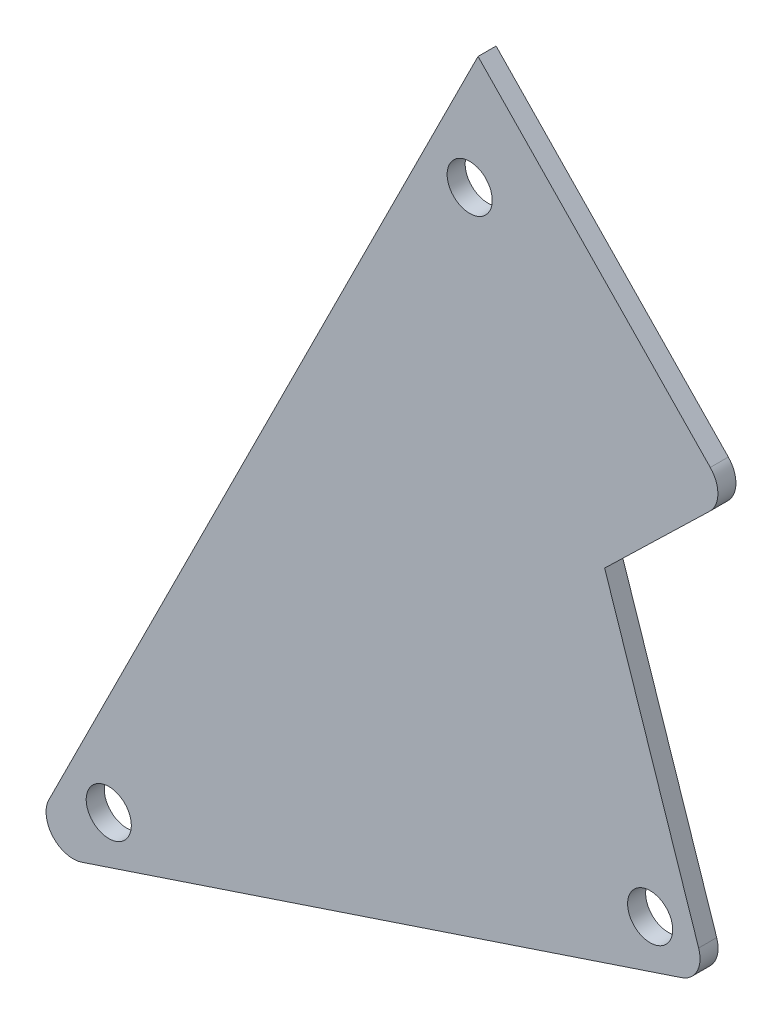
ISO-10303-21;
HEADER;
FILE_DESCRIPTION(('STEP AP214'),'2;1');
FILE_NAME('part.step','',(''),(''),'','','');
FILE_SCHEMA(('AUTOMOTIVE_DESIGN { 1 0 10303 214 1 1 1 1 }'));
ENDSEC;
DATA;
#1=APPLICATION_CONTEXT('core data for automotive mechanical design processes');
#2=APPLICATION_PROTOCOL_DEFINITION('international standard','automotive_design',2000,#1);
#3=PRODUCT_CONTEXT('',#1,'mechanical');
#4=PRODUCT('Part','Part','',(#3));
#5=PRODUCT_RELATED_PRODUCT_CATEGORY('part','',(#4));
#6=PRODUCT_DEFINITION_FORMATION('','',#4);
#7=PRODUCT_DEFINITION_CONTEXT('part definition',#1,'design');
#8=PRODUCT_DEFINITION('design','',#6,#7);
#9=PRODUCT_DEFINITION_SHAPE('','',#8);
#10=(LENGTH_UNIT() NAMED_UNIT(*) SI_UNIT(.MILLI.,.METRE.));
#11=(NAMED_UNIT(*) PLANE_ANGLE_UNIT() SI_UNIT($,.RADIAN.));
#12=(NAMED_UNIT(*) SI_UNIT($,.STERADIAN.) SOLID_ANGLE_UNIT());
#13=UNCERTAINTY_MEASURE_WITH_UNIT(LENGTH_MEASURE(1.E-05),#10,'distance_accuracy_value','');
#14=(GEOMETRIC_REPRESENTATION_CONTEXT(3) GLOBAL_UNCERTAINTY_ASSIGNED_CONTEXT((#13)) GLOBAL_UNIT_ASSIGNED_CONTEXT((#10,
#11,#12)) REPRESENTATION_CONTEXT('',''));
#15=CARTESIAN_POINT('',(0.,0.,0.));
#16=DIRECTION('',(0.,0.,1.));
#17=DIRECTION('',(1.,0.,0.));
#18=AXIS2_PLACEMENT_3D('',#15,#16,#17);
#19=CARTESIAN_POINT('',(0.,0.,2.54));
#20=DIRECTION('',(0.,0.,-1.));
#21=DIRECTION('',(-1.,0.,0.));
#22=AXIS2_PLACEMENT_3D('',#19,#20,#21);
#23=PLANE('',#22);
#24=DIRECTION('',(0.948683298050514,0.316227766016838,0.));
#25=VECTOR('',#24,1.);
#26=CARTESIAN_POINT('',(-88.735511622688,-10.8719915882524,2.54));
#27=LINE('',#26,#25);
#28=CARTESIAN_POINT('',(-80.009376860551,-7.96328000087342,2.54));
#29=VERTEX_POINT('',#28);
#30=CARTESIAN_POINT('',(4.41770189125523,20.179079583062,2.54));
#31=VERTEX_POINT('',#30);
#32=EDGE_CURVE('E118',#29,#31,#27,.T.);
#33=ORIENTED_EDGE('',*,*,#32,.T.);
#34=CARTESIAN_POINT('',(3.21287410273109,23.7935629486345,2.54));
#35=DIRECTION('',(0.,0.,-1.));
#36=DIRECTION('',(-1.,0.,0.));
#37=AXIS2_PLACEMENT_3D('',#34,#35,#36);
#38=CIRCLE('',#37,3.81);
#39=CARTESIAN_POINT('',(6.82735746830354,24.9983907371586,2.54));
#40=VERTEX_POINT('',#39);
#41=EDGE_CURVE('E148',#31,#40,#38,.F.);
#42=ORIENTED_EDGE('',*,*,#41,.T.);
#43=DIRECTION('',(-0.316227766016838,0.948683298050514,0.));
#44=VECTOR('',#43,1.);
#45=CARTESIAN_POINT('',(-6.40451919508798,64.6940207273331,2.54));
#46=LINE('',#45,#44);
#47=CARTESIAN_POINT('',(-6.40451919508798,64.6940207273331,2.54));
#48=VERTEX_POINT('',#47);
#49=EDGE_CURVE('E335',#40,#48,#46,.T.);
#50=ORIENTED_EDGE('',*,*,#49,.T.);
#51=DIRECTION('',(0.718414301247998,0.695615476942794,0.));
#52=VECTOR('',#51,1.);
#53=CARTESIAN_POINT('',(11.113552525683,81.6561577477035,2.54));
#54=LINE('',#53,#52);
#55=CARTESIAN_POINT('',(8.37639403792815,79.0058627805515,2.54));
#56=VERTEX_POINT('',#55);
#57=EDGE_CURVE('E131',#48,#56,#54,.T.);
#58=ORIENTED_EDGE('',*,*,#57,.T.);
#59=CARTESIAN_POINT('',(5.72609907077611,81.7430212683064,2.54));
#60=DIRECTION('',(0.,0.,-1.));
#61=DIRECTION('',(-1.,0.,0.));
#62=AXIS2_PLACEMENT_3D('',#59,#60,#61);
#63=CIRCLE('',#62,3.81);
#64=CARTESIAN_POINT('',(8.46325755853099,84.3933162354584,2.54));
#65=VERTEX_POINT('',#64);
#66=EDGE_CURVE('E108',#56,#65,#63,.F.);
#67=ORIENTED_EDGE('',*,*,#66,.T.);
#68=DIRECTION('',(-0.695615476942794,0.718414301247998,0.));
#69=VECTOR('',#68,1.);
#70=CARTESIAN_POINT('',(-24.2237137030109,118.151604251102,2.54));
#71=LINE('',#70,#69);
#72=CARTESIAN_POINT('',(-24.2237137030109,118.151604251102,2.54));
#73=VERTEX_POINT('',#72);
#74=EDGE_CURVE('E102',#65,#73,#71,.T.);
#75=ORIENTED_EDGE('',*,*,#74,.T.);
#76=DIRECTION('',(-0.447213595499958,-0.894427190999916,0.));
#77=VECTOR('',#76,1.);
#78=CARTESIAN_POINT('',(-24.2237137030109,118.151604251102,2.54));
#79=LINE('',#78,#77);
#80=CARTESIAN_POINT('',(-84.6219722467849,-2.64491283644615,2.54));
#81=VERTEX_POINT('',#80);
#82=EDGE_CURVE('E105',#73,#81,#79,.T.);
#83=ORIENTED_EDGE('',*,*,#82,.T.);
#84=CARTESIAN_POINT('',(-81.2142046490752,-4.34879663530096,2.54));
#85=DIRECTION('',(0.,0.,-1.));
#86=DIRECTION('',(-1.,0.,0.));
#87=AXIS2_PLACEMENT_3D('',#84,#85,#86);
#88=CIRCLE('',#87,3.81);
#89=EDGE_CURVE('E145',#81,#29,#88,.F.);
#90=ORIENTED_EDGE('',*,*,#89,.T.);
#91=EDGE_LOOP('',(#33,#42,#50,#58,#67,#75,#83,#90));
#92=FACE_BOUND('',#91,.T.);
#93=CARTESIAN_POINT('',(-76.2,0.,2.54));
#94=DIRECTION('',(0.,0.,1.));
#95=DIRECTION('',(1.,0.,0.));
#96=AXIS2_PLACEMENT_3D('',#93,#94,#95);
#97=CIRCLE('',#96,3.175);
#98=CARTESIAN_POINT('',(-73.025,0.,2.54));
#99=VERTEX_POINT('',#98);
#100=EDGE_CURVE('E158',#99,#99,#97,.T.);
#101=ORIENTED_EDGE('',*,*,#100,.F.);
#102=EDGE_LOOP('',(#101));
#103=FACE_BOUND('',#102,.T.);
#104=CARTESIAN_POINT('',(0.,25.4,2.54));
#105=DIRECTION('',(0.,0.,1.));
#106=DIRECTION('',(1.,0.,0.));
#107=AXIS2_PLACEMENT_3D('',#104,#105,#106);
#108=CIRCLE('',#107,3.175);
#109=CARTESIAN_POINT('',(3.175,25.4,2.54));
#110=VERTEX_POINT('',#109);
#111=EDGE_CURVE('E328',#110,#110,#108,.T.);
#112=ORIENTED_EDGE('',*,*,#111,.F.);
#113=EDGE_LOOP('',(#112));
#114=FACE_BOUND('',#113,.T.);
#115=CARTESIAN_POINT('',(-25.4,101.6,2.54));
#116=DIRECTION('',(0.,0.,1.));
#117=DIRECTION('',(1.,0.,0.));
#118=AXIS2_PLACEMENT_3D('',#115,#116,#117);
#119=CIRCLE('',#118,3.175);
#120=CARTESIAN_POINT('',(-22.225,101.6,2.54));
#121=VERTEX_POINT('',#120);
#122=EDGE_CURVE('E319',#121,#121,#119,.T.);
#123=ORIENTED_EDGE('',*,*,#122,.F.);
#124=EDGE_LOOP('',(#123));
#125=FACE_BOUND('',#124,.T.);
#126=ADVANCED_FACE('F37',(#92,#103,#114,#125),#23,.F.);
#127=CARTESIAN_POINT('',(0.,0.,0.));
#128=DIRECTION('',(0.,0.,-1.));
#129=DIRECTION('',(-1.,0.,0.));
#130=AXIS2_PLACEMENT_3D('',#127,#128,#129);
#131=PLANE('',#130);
#132=CARTESIAN_POINT('',(0.,25.4,0.));
#133=DIRECTION('',(0.,0.,1.));
#134=DIRECTION('',(1.,0.,0.));
#135=AXIS2_PLACEMENT_3D('',#132,#133,#134);
#136=CIRCLE('',#135,3.175);
#137=CARTESIAN_POINT('',(3.175,25.4,0.));
#138=VERTEX_POINT('',#137);
#139=EDGE_CURVE('E325',#138,#138,#136,.T.);
#140=ORIENTED_EDGE('',*,*,#139,.T.);
#141=EDGE_LOOP('',(#140));
#142=FACE_BOUND('',#141,.T.);
#143=DIRECTION('',(-0.316227766016838,0.948683298050514,0.));
#144=VECTOR('',#143,1.);
#145=CARTESIAN_POINT('',(-6.40451919508798,64.6940207273331,0.));
#146=LINE('',#145,#144);
#147=CARTESIAN_POINT('',(6.82735746830354,24.9983907371586,0.));
#148=VERTEX_POINT('',#147);
#149=CARTESIAN_POINT('',(-6.40451919508798,64.6940207273331,0.));
#150=VERTEX_POINT('',#149);
#151=EDGE_CURVE('E170',#148,#150,#146,.T.);
#152=ORIENTED_EDGE('',*,*,#151,.F.);
#153=CARTESIAN_POINT('',(3.21287410273109,23.7935629486345,0.));
#154=DIRECTION('',(0.,0.,-1.));
#155=DIRECTION('',(-1.,0.,0.));
#156=AXIS2_PLACEMENT_3D('',#153,#154,#155);
#157=CIRCLE('',#156,3.81);
#158=CARTESIAN_POINT('',(4.41770189125523,20.179079583062,0.));
#159=VERTEX_POINT('',#158);
#160=EDGE_CURVE('E138',#148,#159,#157,.T.);
#161=ORIENTED_EDGE('',*,*,#160,.T.);
#162=DIRECTION('',(0.948683298050514,0.316227766016838,0.));
#163=VECTOR('',#162,1.);
#164=CARTESIAN_POINT('',(-88.735511622688,-10.8719915882524,0.));
#165=LINE('',#164,#163);
#166=CARTESIAN_POINT('',(-80.009376860551,-7.96328000087342,0.));
#167=VERTEX_POINT('',#166);
#168=EDGE_CURVE('E160',#167,#159,#165,.T.);
#169=ORIENTED_EDGE('',*,*,#168,.F.);
#170=CARTESIAN_POINT('',(-81.2142046490752,-4.34879663530096,0.));
#171=DIRECTION('',(0.,0.,-1.));
#172=DIRECTION('',(-1.,0.,0.));
#173=AXIS2_PLACEMENT_3D('',#170,#171,#172);
#174=CIRCLE('',#173,3.81);
#175=CARTESIAN_POINT('',(-84.6219722467849,-2.64491283644615,0.));
#176=VERTEX_POINT('',#175);
#177=EDGE_CURVE('E128',#167,#176,#174,.T.);
#178=ORIENTED_EDGE('',*,*,#177,.T.);
#179=DIRECTION('',(-0.447213595499958,-0.894427190999916,0.));
#180=VECTOR('',#179,1.);
#181=CARTESIAN_POINT('',(-24.2237137030109,118.151604251102,0.));
#182=LINE('',#181,#180);
#183=CARTESIAN_POINT('',(-24.2237137030109,118.151604251102,0.));
#184=VERTEX_POINT('',#183);
#185=EDGE_CURVE('E157',#184,#176,#182,.T.);
#186=ORIENTED_EDGE('',*,*,#185,.F.);
#187=DIRECTION('',(-0.695615476942794,0.718414301247998,0.));
#188=VECTOR('',#187,1.);
#189=CARTESIAN_POINT('',(-24.2237137030109,118.151604251102,0.));
#190=LINE('',#189,#188);
#191=CARTESIAN_POINT('',(8.46325755853099,84.3933162354584,0.));
#192=VERTEX_POINT('',#191);
#193=EDGE_CURVE('E122',#192,#184,#190,.T.);
#194=ORIENTED_EDGE('',*,*,#193,.F.);
#195=CARTESIAN_POINT('',(5.72609907077611,81.7430212683064,0.));
#196=DIRECTION('',(0.,0.,-1.));
#197=DIRECTION('',(-1.,0.,0.));
#198=AXIS2_PLACEMENT_3D('',#195,#196,#197);
#199=CIRCLE('',#198,3.81);
#200=CARTESIAN_POINT('',(8.37639403792815,79.0058627805515,0.));
#201=VERTEX_POINT('',#200);
#202=EDGE_CURVE('E136',#192,#201,#199,.T.);
#203=ORIENTED_EDGE('',*,*,#202,.T.);
#204=DIRECTION('',(0.718414301247998,0.695615476942794,0.));
#205=VECTOR('',#204,1.);
#206=CARTESIAN_POINT('',(11.113552525683,81.6561577477035,0.));
#207=LINE('',#206,#205);
#208=EDGE_CURVE('E113',#150,#201,#207,.T.);
#209=ORIENTED_EDGE('',*,*,#208,.F.);
#210=EDGE_LOOP('',(#152,#161,#169,#178,#186,#194,#203,#209));
#211=FACE_BOUND('',#210,.T.);
#212=CARTESIAN_POINT('',(-76.2,0.,0.));
#213=DIRECTION('',(0.,0.,1.));
#214=DIRECTION('',(1.,0.,0.));
#215=AXIS2_PLACEMENT_3D('',#212,#213,#214);
#216=CIRCLE('',#215,3.175);
#217=CARTESIAN_POINT('',(-73.025,0.,0.));
#218=VERTEX_POINT('',#217);
#219=EDGE_CURVE('E163',#218,#218,#216,.T.);
#220=ORIENTED_EDGE('',*,*,#219,.T.);
#221=EDGE_LOOP('',(#220));
#222=FACE_BOUND('',#221,.T.);
#223=CARTESIAN_POINT('',(-25.4,101.6,0.));
#224=DIRECTION('',(0.,0.,1.));
#225=DIRECTION('',(1.,0.,0.));
#226=AXIS2_PLACEMENT_3D('',#223,#224,#225);
#227=CIRCLE('',#226,3.175);
#228=CARTESIAN_POINT('',(-22.225,101.6,0.));
#229=VERTEX_POINT('',#228);
#230=EDGE_CURVE('E322',#229,#229,#227,.T.);
#231=ORIENTED_EDGE('',*,*,#230,.T.);
#232=EDGE_LOOP('',(#231));
#233=FACE_BOUND('',#232,.T.);
#234=ADVANCED_FACE('F154',(#142,#211,#222,#233),#131,.T.);
#235=CARTESIAN_POINT('',(-24.2237137030109,118.151604251102,2.54));
#236=DIRECTION('',(-0.718414301247998,-0.695615476942794,0.));
#237=DIRECTION('',(0.695615476942794,-0.718414301247998,0.));
#238=AXIS2_PLACEMENT_3D('',#235,#236,#237);
#239=PLANE('',#238);
#240=ORIENTED_EDGE('',*,*,#74,.F.);
#241=DIRECTION('',(0.,0.,-1.));
#242=VECTOR('',#241,1.);
#243=CARTESIAN_POINT('',(8.46325755853098,84.3933162354584,2.54));
#244=LINE('',#243,#242);
#245=EDGE_CURVE('E150',#65,#192,#244,.T.);
#246=ORIENTED_EDGE('',*,*,#245,.T.);
#247=ORIENTED_EDGE('',*,*,#193,.T.);
#248=DIRECTION('',(0.,0.,-1.));
#249=VECTOR('',#248,1.);
#250=CARTESIAN_POINT('',(-24.2237137030109,118.151604251102,2.54));
#251=LINE('',#250,#249);
#252=EDGE_CURVE('E117',#73,#184,#251,.T.);
#253=ORIENTED_EDGE('',*,*,#252,.F.);
#254=EDGE_LOOP('',(#240,#246,#247,#253));
#255=FACE_BOUND('',#254,.T.);
#256=ADVANCED_FACE('F120',(#255),#239,.F.);
#257=CARTESIAN_POINT('',(-24.2237137030109,118.151604251102,2.54));
#258=DIRECTION('',(0.894427190999916,-0.447213595499958,0.));
#259=DIRECTION('',(0.447213595499958,0.894427190999916,0.));
#260=AXIS2_PLACEMENT_3D('',#257,#258,#259);
#261=PLANE('',#260);
#262=ORIENTED_EDGE('',*,*,#185,.T.);
#263=DIRECTION('',(0.,0.,-1.));
#264=VECTOR('',#263,1.);
#265=CARTESIAN_POINT('',(-84.6219722467849,-2.64491283644613,2.54));
#266=LINE('',#265,#264);
#267=EDGE_CURVE('E11',#176,#81,#266,.F.);
#268=ORIENTED_EDGE('',*,*,#267,.T.);
#269=ORIENTED_EDGE('',*,*,#82,.F.);
#270=ORIENTED_EDGE('',*,*,#252,.T.);
#271=EDGE_LOOP('',(#262,#268,#269,#270));
#272=FACE_BOUND('',#271,.T.);
#273=ADVANCED_FACE('F116',(#272),#261,.F.);
#274=CARTESIAN_POINT('',(-88.735511622688,-10.8719915882524,2.54));
#275=DIRECTION('',(-0.316227766016838,0.948683298050514,0.));
#276=DIRECTION('',(-0.948683298050514,-0.316227766016838,0.));
#277=AXIS2_PLACEMENT_3D('',#274,#275,#276);
#278=PLANE('',#277);
#279=ORIENTED_EDGE('',*,*,#168,.T.);
#280=DIRECTION('',(0.,0.,-1.));
#281=VECTOR('',#280,1.);
#282=CARTESIAN_POINT('',(4.41770189125523,20.179079583062,2.54));
#283=LINE('',#282,#281);
#284=EDGE_CURVE('E143',#159,#31,#283,.F.);
#285=ORIENTED_EDGE('',*,*,#284,.T.);
#286=ORIENTED_EDGE('',*,*,#32,.F.);
#287=DIRECTION('',(0.,0.,-1.));
#288=VECTOR('',#287,1.);
#289=CARTESIAN_POINT('',(-80.009376860551,-7.96328000087342,2.54));
#290=LINE('',#289,#288);
#291=EDGE_CURVE('E140',#29,#167,#290,.T.);
#292=ORIENTED_EDGE('',*,*,#291,.T.);
#293=EDGE_LOOP('',(#279,#285,#286,#292));
#294=FACE_BOUND('',#293,.T.);
#295=ADVANCED_FACE('F200',(#294),#278,.F.);
#296=CARTESIAN_POINT('',(-6.40451919508798,64.6940207273331,2.54));
#297=DIRECTION('',(-0.948683298050514,-0.316227766016838,0.));
#298=DIRECTION('',(0.316227766016838,-0.948683298050514,0.));
#299=AXIS2_PLACEMENT_3D('',#296,#297,#298);
#300=PLANE('',#299);
#301=ORIENTED_EDGE('',*,*,#49,.F.);
#302=DIRECTION('',(0.,0.,-1.));
#303=VECTOR('',#302,1.);
#304=CARTESIAN_POINT('',(6.82735746830355,24.9983907371586,2.54));
#305=LINE('',#304,#303);
#306=EDGE_CURVE('E124',#40,#148,#305,.T.);
#307=ORIENTED_EDGE('',*,*,#306,.T.);
#308=ORIENTED_EDGE('',*,*,#151,.T.);
#309=DIRECTION('',(0.,0.,-1.));
#310=VECTOR('',#309,1.);
#311=CARTESIAN_POINT('',(-6.40451919508798,64.6940207273331,2.54));
#312=LINE('',#311,#310);
#313=EDGE_CURVE('E125',#48,#150,#312,.T.);
#314=ORIENTED_EDGE('',*,*,#313,.F.);
#315=EDGE_LOOP('',(#301,#307,#308,#314));
#316=FACE_BOUND('',#315,.T.);
#317=ADVANCED_FACE('F197',(#316),#300,.F.);
#318=CARTESIAN_POINT('',(11.113552525683,81.6561577477035,2.54));
#319=DIRECTION('',(-0.695615476942794,0.718414301247998,0.));
#320=DIRECTION('',(-0.718414301247998,-0.695615476942794,0.));
#321=AXIS2_PLACEMENT_3D('',#318,#319,#320);
#322=PLANE('',#321);
#323=ORIENTED_EDGE('',*,*,#208,.T.);
#324=DIRECTION('',(0.,0.,-1.));
#325=VECTOR('',#324,1.);
#326=CARTESIAN_POINT('',(8.37639403792815,79.0058627805515,2.54));
#327=LINE('',#326,#325);
#328=EDGE_CURVE('E45',#201,#56,#327,.F.);
#329=ORIENTED_EDGE('',*,*,#328,.T.);
#330=ORIENTED_EDGE('',*,*,#57,.F.);
#331=ORIENTED_EDGE('',*,*,#313,.T.);
#332=EDGE_LOOP('',(#323,#329,#330,#331));
#333=FACE_BOUND('',#332,.T.);
#334=ADVANCED_FACE('F171',(#333),#322,.F.);
#335=CARTESIAN_POINT('',(-76.2,0.,2.54));
#336=DIRECTION('',(0.,0.,-1.));
#337=DIRECTION('',(-1.,0.,0.));
#338=AXIS2_PLACEMENT_3D('',#335,#336,#337);
#339=CYLINDRICAL_SURFACE('',#338,3.175);
#340=ORIENTED_EDGE('',*,*,#100,.T.);
#341=EDGE_LOOP('',(#340));
#342=FACE_BOUND('',#341,.T.);
#343=ORIENTED_EDGE('',*,*,#219,.F.);
#344=EDGE_LOOP('',(#343));
#345=FACE_BOUND('',#344,.T.);
#346=ADVANCED_FACE('F192',(#342,#345),#339,.F.);
#347=CARTESIAN_POINT('',(0.,25.4,2.54));
#348=DIRECTION('',(0.,0.,-1.));
#349=DIRECTION('',(-1.,0.,0.));
#350=AXIS2_PLACEMENT_3D('',#347,#348,#349);
#351=CYLINDRICAL_SURFACE('',#350,3.175);
#352=ORIENTED_EDGE('',*,*,#111,.T.);
#353=EDGE_LOOP('',(#352));
#354=FACE_BOUND('',#353,.T.);
#355=ORIENTED_EDGE('',*,*,#139,.F.);
#356=EDGE_LOOP('',(#355));
#357=FACE_BOUND('',#356,.T.);
#358=ADVANCED_FACE('F235',(#354,#357),#351,.F.);
#359=CARTESIAN_POINT('',(-25.4,101.6,2.54));
#360=DIRECTION('',(0.,0.,-1.));
#361=DIRECTION('',(-1.,0.,0.));
#362=AXIS2_PLACEMENT_3D('',#359,#360,#361);
#363=CYLINDRICAL_SURFACE('',#362,3.175);
#364=ORIENTED_EDGE('',*,*,#122,.T.);
#365=EDGE_LOOP('',(#364));
#366=FACE_BOUND('',#365,.T.);
#367=ORIENTED_EDGE('',*,*,#230,.F.);
#368=EDGE_LOOP('',(#367));
#369=FACE_BOUND('',#368,.T.);
#370=ADVANCED_FACE('F181',(#366,#369),#363,.F.);
#371=CARTESIAN_POINT('',(3.21287410273109,23.7935629486345,2.54));
#372=DIRECTION('',(0.,0.,-1.));
#373=DIRECTION('',(-1.,0.,0.));
#374=AXIS2_PLACEMENT_3D('',#371,#372,#373);
#375=CYLINDRICAL_SURFACE('',#374,3.81);
#376=ORIENTED_EDGE('',*,*,#41,.F.);
#377=ORIENTED_EDGE('',*,*,#284,.F.);
#378=ORIENTED_EDGE('',*,*,#160,.F.);
#379=ORIENTED_EDGE('',*,*,#306,.F.);
#380=EDGE_LOOP('',(#376,#377,#378,#379));
#381=FACE_BOUND('',#380,.T.);
#382=ADVANCED_FACE('F175',(#381),#375,.T.);
#383=CARTESIAN_POINT('',(5.72609907077611,81.7430212683064,2.54));
#384=DIRECTION('',(0.,0.,-1.));
#385=DIRECTION('',(-1.,0.,0.));
#386=AXIS2_PLACEMENT_3D('',#383,#384,#385);
#387=CYLINDRICAL_SURFACE('',#386,3.81);
#388=ORIENTED_EDGE('',*,*,#66,.F.);
#389=ORIENTED_EDGE('',*,*,#328,.F.);
#390=ORIENTED_EDGE('',*,*,#202,.F.);
#391=ORIENTED_EDGE('',*,*,#245,.F.);
#392=EDGE_LOOP('',(#388,#389,#390,#391));
#393=FACE_BOUND('',#392,.T.);
#394=ADVANCED_FACE('F173',(#393),#387,.T.);
#395=CARTESIAN_POINT('',(-81.2142046490752,-4.34879663530096,2.54));
#396=DIRECTION('',(0.,0.,-1.));
#397=DIRECTION('',(-1.,0.,0.));
#398=AXIS2_PLACEMENT_3D('',#395,#396,#397);
#399=CYLINDRICAL_SURFACE('',#398,3.81);
#400=ORIENTED_EDGE('',*,*,#89,.F.);
#401=ORIENTED_EDGE('',*,*,#267,.F.);
#402=ORIENTED_EDGE('',*,*,#177,.F.);
#403=ORIENTED_EDGE('',*,*,#291,.F.);
#404=EDGE_LOOP('',(#400,#401,#402,#403));
#405=FACE_BOUND('',#404,.T.);
#406=ADVANCED_FACE('F39',(#405),#399,.T.);
#407=CLOSED_SHELL('',(#126,#234,#256,#273,#295,#317,#334,#346,#358,#370,#382,#394,#406));
#408=MANIFOLD_SOLID_BREP('B2',#407);
#409=ADVANCED_BREP_SHAPE_REPRESENTATION('',(#18,#408),#14);
#410=SHAPE_DEFINITION_REPRESENTATION(#9,#409);
ENDSEC;
END-ISO-10303-21;
